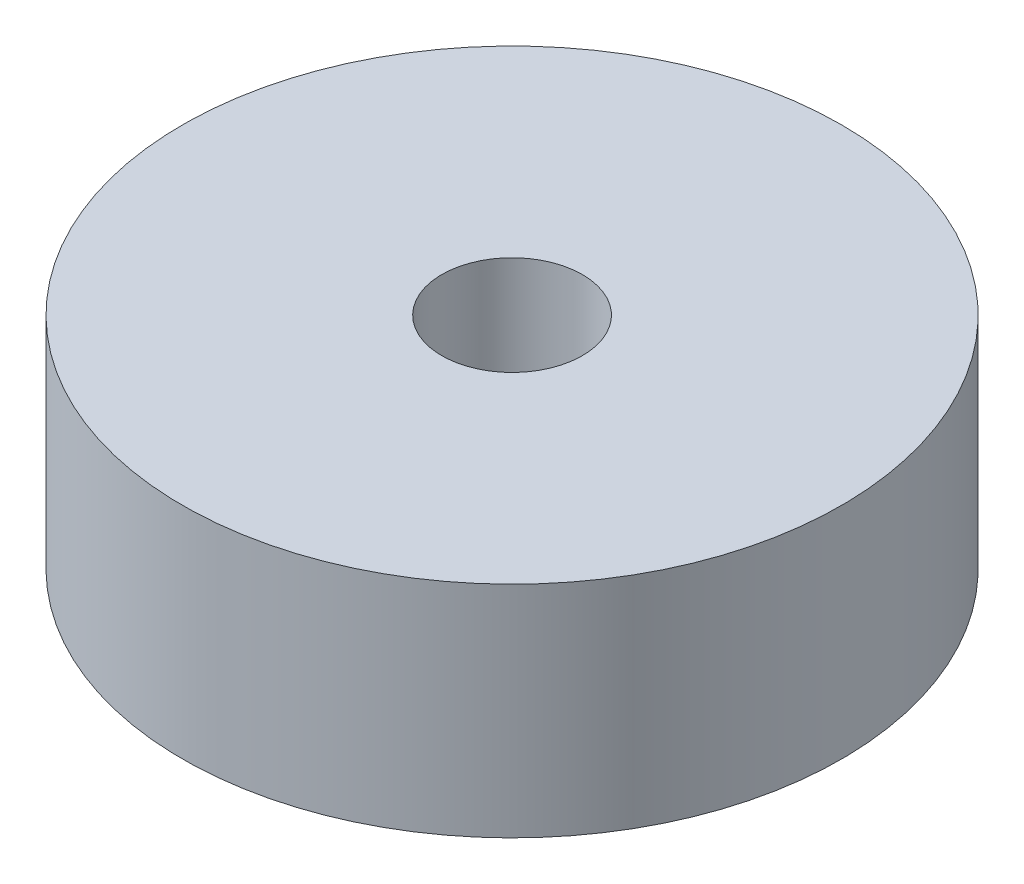
ISO-10303-21;
HEADER;
FILE_DESCRIPTION(('STEP AP214'),'2;1');
FILE_NAME('part.step','',(''),(''),'','','');
FILE_SCHEMA(('AUTOMOTIVE_DESIGN { 1 0 10303 214 1 1 1 1 }'));
ENDSEC;
DATA;
#1=APPLICATION_CONTEXT('core data for automotive mechanical design processes');
#2=APPLICATION_PROTOCOL_DEFINITION('international standard','automotive_design',2000,#1);
#3=PRODUCT_CONTEXT('',#1,'mechanical');
#4=PRODUCT('Part','Part','',(#3));
#5=PRODUCT_RELATED_PRODUCT_CATEGORY('part','',(#4));
#6=PRODUCT_DEFINITION_FORMATION('','',#4);
#7=PRODUCT_DEFINITION_CONTEXT('part definition',#1,'design');
#8=PRODUCT_DEFINITION('design','',#6,#7);
#9=PRODUCT_DEFINITION_SHAPE('','',#8);
#10=(LENGTH_UNIT() NAMED_UNIT(*) SI_UNIT(.MILLI.,.METRE.));
#11=(NAMED_UNIT(*) PLANE_ANGLE_UNIT() SI_UNIT($,.RADIAN.));
#12=(NAMED_UNIT(*) SI_UNIT($,.STERADIAN.) SOLID_ANGLE_UNIT());
#13=UNCERTAINTY_MEASURE_WITH_UNIT(LENGTH_MEASURE(1.E-05),#10,'distance_accuracy_value','');
#14=(GEOMETRIC_REPRESENTATION_CONTEXT(3) GLOBAL_UNCERTAINTY_ASSIGNED_CONTEXT((#13)) GLOBAL_UNIT_ASSIGNED_CONTEXT((#10,
#11,#12)) REPRESENTATION_CONTEXT('',''));
#15=CARTESIAN_POINT('',(0.,0.,0.));
#16=DIRECTION('',(0.,0.,1.));
#17=DIRECTION('',(1.,0.,0.));
#18=AXIS2_PLACEMENT_3D('',#15,#16,#17);
#19=CARTESIAN_POINT('',(0.,5.,0.));
#20=DIRECTION('',(0.,1.,0.));
#21=DIRECTION('',(0.,0.,-1.));
#22=AXIS2_PLACEMENT_3D('',#19,#20,#21);
#23=PLANE('',#22);
#24=CARTESIAN_POINT('',(0.,5.,0.));
#25=DIRECTION('',(0.,-1.,0.));
#26=DIRECTION('',(0.,0.,-1.));
#27=AXIS2_PLACEMENT_3D('',#24,#25,#26);
#28=CIRCLE('',#27,7.5);
#29=CARTESIAN_POINT('',(0.,5.,-7.5));
#30=VERTEX_POINT('',#29);
#31=EDGE_CURVE('E10',#30,#30,#28,.T.);
#32=ORIENTED_EDGE('',*,*,#31,.F.);
#33=EDGE_LOOP('',(#32));
#34=FACE_BOUND('',#33,.T.);
#35=CARTESIAN_POINT('',(0.,5.,0.));
#36=DIRECTION('',(0.,-1.,0.));
#37=DIRECTION('',(0.,0.,-1.));
#38=AXIS2_PLACEMENT_3D('',#35,#36,#37);
#39=CIRCLE('',#38,1.6);
#40=CARTESIAN_POINT('',(0.,5.,-1.6));
#41=VERTEX_POINT('',#40);
#42=EDGE_CURVE('E46',#41,#41,#39,.T.);
#43=ORIENTED_EDGE('',*,*,#42,.T.);
#44=EDGE_LOOP('',(#43));
#45=FACE_BOUND('',#44,.T.);
#46=ADVANCED_FACE('F35',(#34,#45),#23,.T.);
#47=CARTESIAN_POINT('',(0.,0.,0.));
#48=DIRECTION('',(0.,1.,0.));
#49=DIRECTION('',(0.,0.,-1.));
#50=AXIS2_PLACEMENT_3D('',#47,#48,#49);
#51=PLANE('',#50);
#52=CARTESIAN_POINT('',(0.,0.,0.));
#53=DIRECTION('',(0.,-1.,0.));
#54=DIRECTION('',(0.,0.,-1.));
#55=AXIS2_PLACEMENT_3D('',#52,#53,#54);
#56=CIRCLE('',#55,7.5);
#57=CARTESIAN_POINT('',(0.,0.,-7.5));
#58=VERTEX_POINT('',#57);
#59=EDGE_CURVE('E39',#58,#58,#56,.T.);
#60=ORIENTED_EDGE('',*,*,#59,.T.);
#61=EDGE_LOOP('',(#60));
#62=FACE_BOUND('',#61,.T.);
#63=CARTESIAN_POINT('',(0.,0.,0.));
#64=DIRECTION('',(0.,-1.,0.));
#65=DIRECTION('',(0.,0.,-1.));
#66=AXIS2_PLACEMENT_3D('',#63,#64,#65);
#67=CIRCLE('',#66,1.6);
#68=CARTESIAN_POINT('',(0.,0.,-1.6));
#69=VERTEX_POINT('',#68);
#70=EDGE_CURVE('E48',#69,#69,#67,.T.);
#71=ORIENTED_EDGE('',*,*,#70,.F.);
#72=EDGE_LOOP('',(#71));
#73=FACE_BOUND('',#72,.T.);
#74=ADVANCED_FACE('F61',(#62,#73),#51,.F.);
#75=CARTESIAN_POINT('',(0.,5.,0.));
#76=DIRECTION('',(0.,-1.,0.));
#77=DIRECTION('',(0.,0.,1.));
#78=AXIS2_PLACEMENT_3D('',#75,#76,#77);
#79=CYLINDRICAL_SURFACE('',#78,7.5);
#80=ORIENTED_EDGE('',*,*,#31,.T.);
#81=EDGE_LOOP('',(#80));
#82=FACE_BOUND('',#81,.T.);
#83=ORIENTED_EDGE('',*,*,#59,.F.);
#84=EDGE_LOOP('',(#83));
#85=FACE_BOUND('',#84,.T.);
#86=ADVANCED_FACE('F37',(#82,#85),#79,.T.);
#87=CARTESIAN_POINT('',(0.,5.,0.));
#88=DIRECTION('',(0.,-1.,0.));
#89=DIRECTION('',(0.,0.,1.));
#90=AXIS2_PLACEMENT_3D('',#87,#88,#89);
#91=CYLINDRICAL_SURFACE('',#90,1.6);
#92=ORIENTED_EDGE('',*,*,#42,.F.);
#93=EDGE_LOOP('',(#92));
#94=FACE_BOUND('',#93,.T.);
#95=ORIENTED_EDGE('',*,*,#70,.T.);
#96=EDGE_LOOP('',(#95));
#97=FACE_BOUND('',#96,.T.);
#98=ADVANCED_FACE('F55',(#94,#97),#91,.F.);
#99=CLOSED_SHELL('',(#46,#74,#86,#98));
#100=MANIFOLD_SOLID_BREP('B2',#99);
#101=ADVANCED_BREP_SHAPE_REPRESENTATION('',(#18,#100),#14);
#102=SHAPE_DEFINITION_REPRESENTATION(#9,#101);
ENDSEC;
END-ISO-10303-21;
